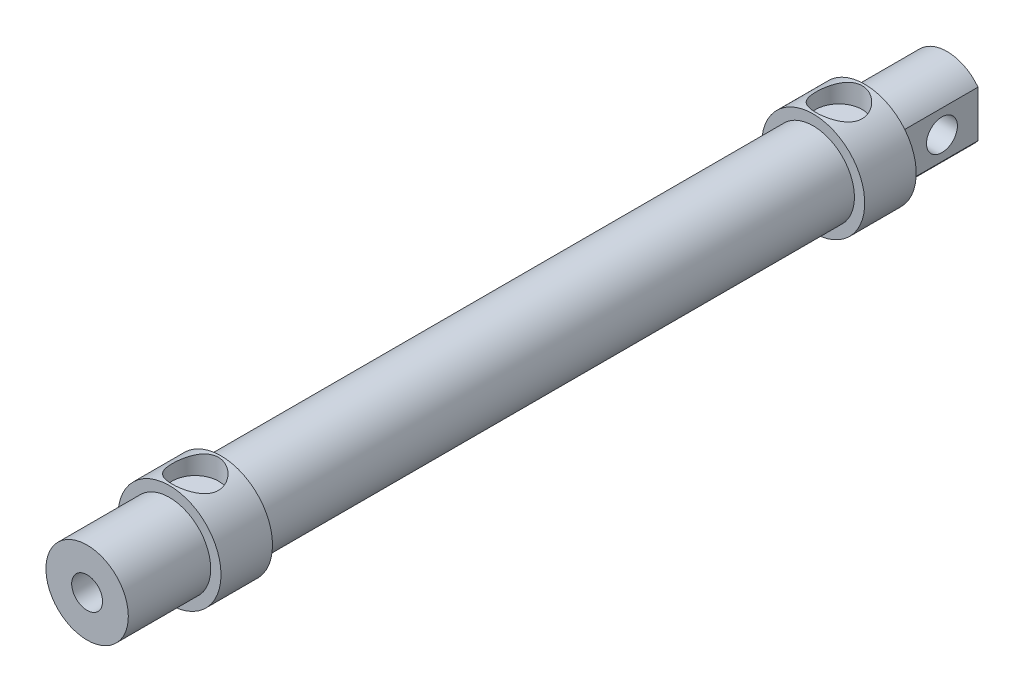
ISO-10303-21;
HEADER;
FILE_DESCRIPTION(('STEP AP214'),'2;1');
FILE_NAME('part.step','',(''),(''),'','','');
FILE_SCHEMA(('AUTOMOTIVE_DESIGN { 1 0 10303 214 1 1 1 1 }'));
ENDSEC;
DATA;
#1=APPLICATION_CONTEXT('core data for automotive mechanical design processes');
#2=APPLICATION_PROTOCOL_DEFINITION('international standard','automotive_design',2000,#1);
#3=PRODUCT_CONTEXT('',#1,'mechanical');
#4=PRODUCT('Part','Part','',(#3));
#5=PRODUCT_RELATED_PRODUCT_CATEGORY('part','',(#4));
#6=PRODUCT_DEFINITION_FORMATION('','',#4);
#7=PRODUCT_DEFINITION_CONTEXT('part definition',#1,'design');
#8=PRODUCT_DEFINITION('design','',#6,#7);
#9=PRODUCT_DEFINITION_SHAPE('','',#8);
#10=(LENGTH_UNIT() NAMED_UNIT(*) SI_UNIT(.MILLI.,.METRE.));
#11=(NAMED_UNIT(*) PLANE_ANGLE_UNIT() SI_UNIT($,.RADIAN.));
#12=(NAMED_UNIT(*) SI_UNIT($,.STERADIAN.) SOLID_ANGLE_UNIT());
#13=UNCERTAINTY_MEASURE_WITH_UNIT(LENGTH_MEASURE(1.E-05),#10,'distance_accuracy_value','');
#14=(GEOMETRIC_REPRESENTATION_CONTEXT(3) GLOBAL_UNCERTAINTY_ASSIGNED_CONTEXT((#13)) GLOBAL_UNIT_ASSIGNED_CONTEXT((#10,
#11,#12)) REPRESENTATION_CONTEXT('',''));
#15=CARTESIAN_POINT('',(0.,0.,0.));
#16=DIRECTION('',(0.,0.,1.));
#17=DIRECTION('',(1.,0.,0.));
#18=AXIS2_PLACEMENT_3D('',#15,#16,#17);
#19=CARTESIAN_POINT('',(0.,0.,-26.));
#20=DIRECTION('',(0.,0.,1.));
#21=DIRECTION('',(1.,0.,0.));
#22=AXIS2_PLACEMENT_3D('',#19,#20,#21);
#23=CYLINDRICAL_SURFACE('',#22,7.5);
#24=CARTESIAN_POINT('',(0.,0.,-26.));
#25=DIRECTION('',(0.,0.,-1.));
#26=DIRECTION('',(-1.,0.,0.));
#27=AXIS2_PLACEMENT_3D('',#24,#25,#26);
#28=CIRCLE('',#27,7.5);
#29=CARTESIAN_POINT('',(6.,-4.5,-26.));
#30=VERTEX_POINT('',#29);
#31=CARTESIAN_POINT('',(-6.,-4.5,-26.));
#32=VERTEX_POINT('',#31);
#33=EDGE_CURVE('E99',#30,#32,#28,.T.);
#34=ORIENTED_EDGE('',*,*,#33,.F.);
#35=DIRECTION('',(0.,0.,-1.));
#36=VECTOR('',#35,1.);
#37=CARTESIAN_POINT('',(6.,-4.5,-0.875856204552675));
#38=LINE('',#37,#36);
#39=CARTESIAN_POINT('',(6.,-4.5,-10.));
#40=VERTEX_POINT('',#39);
#41=EDGE_CURVE('E53',#40,#30,#38,.T.);
#42=ORIENTED_EDGE('',*,*,#41,.F.);
#43=CARTESIAN_POINT('',(0.,0.,-10.));
#44=DIRECTION('',(0.,0.,-1.));
#45=DIRECTION('',(-1.,0.,0.));
#46=AXIS2_PLACEMENT_3D('',#43,#44,#45);
#47=CIRCLE('',#46,7.5);
#48=CARTESIAN_POINT('',(-6.,-4.5,-10.));
#49=VERTEX_POINT('',#48);
#50=EDGE_CURVE('E109',#40,#49,#47,.T.);
#51=ORIENTED_EDGE('',*,*,#50,.T.);
#52=DIRECTION('',(0.,0.,-1.));
#53=VECTOR('',#52,1.);
#54=CARTESIAN_POINT('',(-6.,-4.5,-0.875856204552675));
#55=LINE('',#54,#53);
#56=EDGE_CURVE('E192',#49,#32,#55,.T.);
#57=ORIENTED_EDGE('',*,*,#56,.T.);
#58=EDGE_LOOP('',(#34,#42,#51,#57));
#59=FACE_BOUND('',#58,.T.);
#60=ADVANCED_FACE('F34',(#59),#23,.T.);
#61=CARTESIAN_POINT('',(0.,0.,-10.));
#62=DIRECTION('',(0.,0.,-1.));
#63=DIRECTION('',(-1.,0.,0.));
#64=AXIS2_PLACEMENT_3D('',#61,#62,#63);
#65=PLANE('',#64);
#66=CARTESIAN_POINT('',(0.,0.,-10.));
#67=DIRECTION('',(0.,0.,-1.));
#68=DIRECTION('',(-1.,0.,0.));
#69=AXIS2_PLACEMENT_3D('',#66,#67,#68);
#70=CIRCLE('',#69,10.);
#71=CARTESIAN_POINT('',(-10.,0.,-10.));
#72=VERTEX_POINT('',#71);
#73=EDGE_CURVE('E119',#72,#72,#70,.T.);
#74=ORIENTED_EDGE('',*,*,#73,.T.);
#75=EDGE_LOOP('',(#74));
#76=FACE_BOUND('',#75,.T.);
#77=CARTESIAN_POINT('',(-6.,4.5,-10.));
#78=VERTEX_POINT('',#77);
#79=CARTESIAN_POINT('',(6.,4.5,-10.));
#80=VERTEX_POINT('',#79);
#81=EDGE_CURVE('E93',#78,#80,#47,.T.);
#82=ORIENTED_EDGE('',*,*,#81,.F.);
#83=DIRECTION('',(0.,1.,0.));
#84=VECTOR('',#83,1.);
#85=CARTESIAN_POINT('',(-6.,4.5,-10.));
#86=LINE('',#85,#84);
#87=EDGE_CURVE('E200',#49,#78,#86,.T.);
#88=ORIENTED_EDGE('',*,*,#87,.F.);
#89=ORIENTED_EDGE('',*,*,#50,.F.);
#90=DIRECTION('',(0.,-1.,0.));
#91=VECTOR('',#90,1.);
#92=CARTESIAN_POINT('',(6.,4.5,-10.));
#93=LINE('',#92,#91);
#94=EDGE_CURVE('E94',#80,#40,#93,.T.);
#95=ORIENTED_EDGE('',*,*,#94,.F.);
#96=EDGE_LOOP('',(#82,#88,#89,#95));
#97=FACE_BOUND('',#96,.T.);
#98=ADVANCED_FACE('F168',(#76,#97),#65,.T.);
#99=CARTESIAN_POINT('',(0.,0.,125.));
#100=DIRECTION('',(0.,0.,1.));
#101=DIRECTION('',(1.,0.,0.));
#102=AXIS2_PLACEMENT_3D('',#99,#100,#101);
#103=PLANE('',#102);
#104=CARTESIAN_POINT('',(0.,0.,125.));
#105=DIRECTION('',(0.,0.,1.));
#106=DIRECTION('',(1.,0.,0.));
#107=AXIS2_PLACEMENT_3D('',#104,#105,#106);
#108=CIRCLE('',#107,10.);
#109=CARTESIAN_POINT('',(10.,0.,125.));
#110=VERTEX_POINT('',#109);
#111=EDGE_CURVE('E113',#110,#110,#108,.T.);
#112=ORIENTED_EDGE('',*,*,#111,.T.);
#113=EDGE_LOOP('',(#112));
#114=FACE_BOUND('',#113,.T.);
#115=CARTESIAN_POINT('',(0.,0.,125.));
#116=DIRECTION('',(0.,0.,1.));
#117=DIRECTION('',(1.,0.,0.));
#118=AXIS2_PLACEMENT_3D('',#115,#116,#117);
#119=CIRCLE('',#118,8.);
#120=CARTESIAN_POINT('',(8.,0.,125.));
#121=VERTEX_POINT('',#120);
#122=EDGE_CURVE('E98',#121,#121,#119,.T.);
#123=ORIENTED_EDGE('',*,*,#122,.F.);
#124=EDGE_LOOP('',(#123));
#125=FACE_BOUND('',#124,.T.);
#126=ADVANCED_FACE('F166',(#114,#125),#103,.T.);
#127=CARTESIAN_POINT('',(0.,0.,115.));
#128=DIRECTION('',(0.,0.,-1.));
#129=DIRECTION('',(-1.,0.,0.));
#130=AXIS2_PLACEMENT_3D('',#127,#128,#129);
#131=CYLINDRICAL_SURFACE('',#130,8.);
#132=CARTESIAN_POINT('',(0.,0.,115.));
#133=DIRECTION('',(0.,0.,1.));
#134=DIRECTION('',(1.,0.,0.));
#135=AXIS2_PLACEMENT_3D('',#132,#133,#134);
#136=CIRCLE('',#135,8.);
#137=CARTESIAN_POINT('',(8.,0.,115.));
#138=VERTEX_POINT('',#137);
#139=EDGE_CURVE('E127',#138,#138,#136,.T.);
#140=ORIENTED_EDGE('',*,*,#139,.F.);
#141=EDGE_LOOP('',(#140));
#142=FACE_BOUND('',#141,.T.);
#143=CARTESIAN_POINT('',(0.,0.,0.));
#144=DIRECTION('',(0.,0.,-1.));
#145=DIRECTION('',(-1.,0.,0.));
#146=AXIS2_PLACEMENT_3D('',#143,#144,#145);
#147=CIRCLE('',#146,8.);
#148=CARTESIAN_POINT('',(-8.,0.,0.));
#149=VERTEX_POINT('',#148);
#150=EDGE_CURVE('E122',#149,#149,#147,.T.);
#151=ORIENTED_EDGE('',*,*,#150,.F.);
#152=EDGE_LOOP('',(#151));
#153=FACE_BOUND('',#152,.T.);
#154=ADVANCED_FACE('F36',(#142,#153),#131,.T.);
#155=CARTESIAN_POINT('',(0.,0.,0.));
#156=DIRECTION('',(0.,0.,-1.));
#157=DIRECTION('',(-1.,0.,0.));
#158=AXIS2_PLACEMENT_3D('',#155,#156,#157);
#159=PLANE('',#158);
#160=CARTESIAN_POINT('',(0.,0.,0.));
#161=DIRECTION('',(0.,0.,-1.));
#162=DIRECTION('',(-1.,0.,0.));
#163=AXIS2_PLACEMENT_3D('',#160,#161,#162);
#164=CIRCLE('',#163,10.);
#165=CARTESIAN_POINT('',(-10.,0.,0.));
#166=VERTEX_POINT('',#165);
#167=EDGE_CURVE('E116',#166,#166,#164,.T.);
#168=ORIENTED_EDGE('',*,*,#167,.F.);
#169=EDGE_LOOP('',(#168));
#170=FACE_BOUND('',#169,.T.);
#171=ORIENTED_EDGE('',*,*,#150,.T.);
#172=EDGE_LOOP('',(#171));
#173=FACE_BOUND('',#172,.T.);
#174=ADVANCED_FACE('F179',(#170,#173),#159,.F.);
#175=CARTESIAN_POINT('',(0.,0.,-10.));
#176=DIRECTION('',(0.,0.,1.));
#177=DIRECTION('',(1.,0.,0.));
#178=AXIS2_PLACEMENT_3D('',#175,#176,#177);
#179=CYLINDRICAL_SURFACE('',#178,10.);
#180=CARTESIAN_POINT('',(0.,10.,-0.5));
#181=CARTESIAN_POINT('',(-0.119714899377499,9.9999992514518,-0.500000890002053));
#182=CARTESIAN_POINT('',(-0.239458239717201,9.99784463505232,-0.504783412476652));
#183=CARTESIAN_POINT('',(-0.478080983317484,9.98927965727141,-0.523865659464688));
#184=CARTESIAN_POINT('',(-0.596959866644426,9.98286691941227,-0.5381706985508));
#185=CARTESIAN_POINT('',(-0.833135767847142,9.96593822146435,-0.576176454268108));
#186=CARTESIAN_POINT('',(-0.95042948162941,9.95541475137588,-0.599894368791951));
#187=CARTESIAN_POINT('',(-1.18241652499653,9.93053425585604,-0.656481215828374));
#188=CARTESIAN_POINT('',(-1.29710877072352,9.9161756632967,-0.689353889441735));
#189=CARTESIAN_POINT('',(-1.52263079506398,9.88405335147029,-0.76377129881031));
#190=CARTESIAN_POINT('',(-1.63347432992206,9.86630365187219,-0.805280390300351));
#191=CARTESIAN_POINT('',(-1.85112746101417,9.82779572783996,-0.896674636814239));
#192=CARTESIAN_POINT('',(-1.95793552697273,9.80703637627835,-0.94656293099961));
#193=CARTESIAN_POINT('',(-2.27123792734134,9.74098955379221,-1.10813742169027));
#194=CARTESIAN_POINT('',(-2.47089116747384,9.6918914827054,-1.23182671204988));
#195=CARTESIAN_POINT('',(-2.85732103985941,9.58530406137092,-1.51487693309343));
#196=CARTESIAN_POINT('',(-3.0428957633747,9.52751186527258,-1.67575321002514));
#197=CARTESIAN_POINT('',(-3.38550875317661,9.4112213394932,-2.02538852490223));
#198=CARTESIAN_POINT('',(-3.5425295803198,9.35272260139618,-2.21416447571153));
#199=CARTESIAN_POINT('',(-3.83290348383043,9.23768019338741,-2.6280080759245));
#200=CARTESIAN_POINT('',(-3.96429017948437,9.18146042532477,-2.85456750336845));
#201=CARTESIAN_POINT('',(-4.13093390700541,9.10708951066568,-3.2104155566));
#202=CARTESIAN_POINT('',(-4.18142203880366,9.08395233098873,-3.33174721937629));
#203=CARTESIAN_POINT('',(-4.27176580262694,9.04181979927299,-3.57897853706182));
#204=CARTESIAN_POINT('',(-4.31162720701697,9.02282219967141,-3.70487566964333));
#205=CARTESIAN_POINT('',(-4.37841999028415,8.99059179237455,-3.95351636569529));
#206=CARTESIAN_POINT('',(-4.40592440136942,8.97710693927065,-4.07607376082319));
#207=CARTESIAN_POINT('',(-4.45062326107638,8.95503078908064,-4.32343771638688));
#208=CARTESIAN_POINT('',(-4.46782272017156,8.94643711390801,-4.44824315332329));
#209=CARTESIAN_POINT('',(-4.49169233969261,8.93447700956661,-4.69906118347091));
#210=CARTESIAN_POINT('',(-4.49836639340772,8.93110864759093,-4.82507331297275));
#211=CARTESIAN_POINT('',(-4.50110340099379,8.92972961454464,-5.07723625895438));
#212=CARTESIAN_POINT('',(-4.49716706417789,8.93171858533204,-5.20338706559995));
#213=CARTESIAN_POINT('',(-4.47959284063994,8.94054436393744,-5.4430787367774));
#214=CARTESIAN_POINT('',(-4.46688667651571,8.94691540416729,-5.55670597513979));
#215=CARTESIAN_POINT('',(-4.43293658086699,8.96378380003499,-5.78237804022222));
#216=CARTESIAN_POINT('',(-4.41168989784837,8.97428248545005,-5.8944223449158));
#217=CARTESIAN_POINT('',(-4.33544598173778,9.011503722142,-6.22699755312078));
#218=CARTESIAN_POINT('',(-4.26793076595448,9.04395916378106,-6.44415783870878));
#219=CARTESIAN_POINT('',(-4.10015888915263,9.12125693016516,-6.86871203227035));
#220=CARTESIAN_POINT('',(-3.99919587349869,9.16636294593646,-7.07577372133454));
#221=CARTESIAN_POINT('',(-3.76787528527297,9.26384610310325,-7.47093999468946));
#222=CARTESIAN_POINT('',(-3.63750520457291,9.31622633489086,-7.65903646282433));
#223=CARTESIAN_POINT('',(-3.33583227515682,9.4287142395038,-8.03069920903984));
#224=CARTESIAN_POINT('',(-3.16173786385567,9.48907048526043,-8.21192585812123));
#225=CARTESIAN_POINT('',(-2.78500415457925,9.60638078718318,-8.54353558496202));
#226=CARTESIAN_POINT('',(-2.58235582919845,9.66333375925335,-8.69390887126685));
#227=CARTESIAN_POINT('',(-2.25721570243328,9.74258846497997,-8.89512020664333));
#228=CARTESIAN_POINT('',(-2.1433872205526,9.76832203062482,-8.95891242814095));
#229=CARTESIAN_POINT('',(-1.91009036946106,9.81660379138816,-9.07659125533208));
#230=CARTESIAN_POINT('',(-1.79062435375876,9.83915330033476,-9.13048194944534));
#231=CARTESIAN_POINT('',(-1.54690648548244,9.88040267650027,-9.22780064333651));
#232=CARTESIAN_POINT('',(-1.42265607187478,9.89910369063005,-9.27123176088862));
#233=CARTESIAN_POINT('',(-1.17028710145184,9.93210014831025,-9.34715821062613));
#234=CARTESIAN_POINT('',(-1.04216889591685,9.94639599063306,-9.37965453269401));
#235=CARTESIAN_POINT('',(-0.792376984920266,9.96928945175045,-9.43139136776798));
#236=CARTESIAN_POINT('',(-0.670894892411247,9.97822061403935,-9.45141166745289));
#237=CARTESIAN_POINT('',(-0.426459268412432,9.9916520406954,-9.48143859694167));
#238=CARTESIAN_POINT('',(-0.303505835771769,9.99615260105112,-9.4914458956698));
#239=CARTESIAN_POINT('',(-0.0571459633958022,10.0005953916074,-9.50132510559218));
#240=CARTESIAN_POINT('',(0.0662603342467419,10.0005389466492,-9.50119996255352));
#241=CARTESIAN_POINT('',(0.312555788056655,9.99587319016683,-9.49082418918375));
#242=CARTESIAN_POINT('',(0.435444959409023,9.99126401328015,-9.48057385828387));
#243=CARTESIAN_POINT('',(0.67237330219901,9.97803225420679,-9.45098782056628));
#244=CARTESIAN_POINT('',(0.786500047827908,9.9696678602719,-9.4322359240705));
#245=CARTESIAN_POINT('',(1.01266797335818,9.94924261322972,-9.38609693677835));
#246=CARTESIAN_POINT('',(1.12470846873294,9.93718056877868,-9.35870706283538));
#247=CARTESIAN_POINT('',(1.45652628438278,9.89585863600817,-9.26395657040564));
#248=CARTESIAN_POINT('',(1.67220954839673,9.86145048700206,-9.18398844309207));
#249=CARTESIAN_POINT('',(2.09364161657217,9.78081050149538,-8.99026516024635));
#250=CARTESIAN_POINT('',(2.29887244489482,9.7342440610747,-8.87553607676711));
#251=CARTESIAN_POINT('',(2.68794274227257,9.63407218762379,-8.61657138991768));
#252=CARTESIAN_POINT('',(2.87177279900524,9.58046367930153,-8.47232287988325));
#253=CARTESIAN_POINT('',(3.22874481881242,9.46642342235631,-8.14462956850864));
#254=CARTESIAN_POINT('',(3.39975739919774,9.40579345325527,-7.95893420918039));
#255=CARTESIAN_POINT('',(3.7089928529427,9.28820745525924,-7.56063731302618));
#256=CARTESIAN_POINT('',(3.84720314960723,9.23125284160317,-7.3480255039413));
#257=CARTESIAN_POINT('',(4.02836218298274,9.15296575683414,-7.00979638048813));
#258=CARTESIAN_POINT('',(4.08494101420093,9.12778463759271,-6.89218603099664));
#259=CARTESIAN_POINT('',(4.18787248114614,9.08101974034093,-6.65190156568623));
#260=CARTESIAN_POINT('',(4.2342296566971,9.05943436636988,-6.52922972672152));
#261=CARTESIAN_POINT('',(4.31618722109356,9.02067545662568,-6.27975073171213));
#262=CARTESIAN_POINT('',(4.35179413888921,9.00349924399134,-6.15294613767421));
#263=CARTESIAN_POINT('',(4.41183693193977,8.97423060317641,-5.89614401561104));
#264=CARTESIAN_POINT('',(4.43627411415682,8.96213758022901,-5.76614686302123));
#265=CARTESIAN_POINT('',(4.47202091449907,8.94434960712291,-5.51541826278566));
#266=CARTESIAN_POINT('',(4.4842807024604,8.93819292562724,-5.39485427283057));
#267=CARTESIAN_POINT('',(4.49903019914858,8.93077809281634,-5.15298260566588));
#268=CARTESIAN_POINT('',(4.5015205682304,8.92951961041187,-5.0316749792769));
#269=CARTESIAN_POINT('',(4.49669929744397,8.93194839334479,-4.7893299111345));
#270=CARTESIAN_POINT('',(4.48938957603767,8.93563469069406,-4.66829242114495));
#271=CARTESIAN_POINT('',(4.46506798264277,8.94781267924994,-4.42744554285085));
#272=CARTESIAN_POINT('',(4.44805628051732,8.95630428632473,-4.30763613308236));
#273=CARTESIAN_POINT('',(4.40592367546869,8.97710145887841,-4.07771284236705));
#274=CARTESIAN_POINT('',(4.38138644823706,8.98913052816038,-3.96746647533706));
#275=CARTESIAN_POINT('',(4.3242379973795,9.016760258177,-3.74953045357018));
#276=CARTESIAN_POINT('',(4.29162401522606,9.03236213902907,-3.64184168615339));
#277=CARTESIAN_POINT('',(4.18209790413275,9.08386579740127,-3.3236018253385));
#278=CARTESIAN_POINT('',(4.09347240108939,9.12448081079357,-3.11772001581903));
#279=CARTESIAN_POINT('',(3.88104703097752,9.21692269648097,-2.71007954773134));
#280=CARTESIAN_POINT('',(3.75534202990489,9.26930504512267,-2.50944994717334));
#281=CARTESIAN_POINT('',(3.47477312444683,9.37809249113928,-2.13093860235509));
#282=CARTESIAN_POINT('',(3.31989665958057,9.43449931482618,-1.95306671258599));
#283=CARTESIAN_POINT('',(2.96865270415693,9.55113675133759,-1.60841002335675));
#284=CARTESIAN_POINT('',(2.7697974169835,9.61125079600769,-1.44408972325795));
#285=CARTESIAN_POINT('',(2.451697736392,9.69542725222155,-1.22430517835498));
#286=CARTESIAN_POINT('',(2.34226381477152,9.7225067115913,-1.15544749171922));
#287=CARTESIAN_POINT('',(2.11740450774386,9.77393805362308,-1.02717708698299));
#288=CARTESIAN_POINT('',(2.00198193536715,9.79829120023319,-0.967759986722742));
#289=CARTESIAN_POINT('',(1.76699253742287,9.84336943677559,-0.85942943181218));
#290=CARTESIAN_POINT('',(1.64747506142007,9.8641265763463,-0.81042220355186));
#291=CARTESIAN_POINT('',(1.40416398949856,9.90168985287585,-0.722730737933654));
#292=CARTESIAN_POINT('',(1.28037249014286,9.91849789629377,-0.684041518247569));
#293=CARTESIAN_POINT('',(1.02972097012304,9.94764083982698,-0.617483426496842));
#294=CARTESIAN_POINT('',(0.90286899929365,9.95998634549706,-0.589588888767578));
#295=CARTESIAN_POINT('',(0.64692353237821,9.97987682190862,-0.544851730685118));
#296=CARTESIAN_POINT('',(0.517831638287638,9.98742508914182,-0.528001520812594));
#297=CARTESIAN_POINT('',(0.32368296793252,9.99496914098584,-0.511188557769922));
#298=CARTESIAN_POINT('',(0.259036146622593,9.99685406786943,-0.506994634848498));
#299=CARTESIAN_POINT('',(0.129595662689027,9.99936970855439,-0.501400095969313));
#300=CARTESIAN_POINT('',(0.0648019980679326,10.0000004051912,-0.499999518239486));
#301=CARTESIAN_POINT('',(0.,10.,-0.5));
#302=B_SPLINE_CURVE_WITH_KNOTS('',3,(#180,#181,#182,#183,#184,#185,#186,#187,#188,#189,#190,
#191,#192,#193,#194,#195,#196,#197,#198,#199,#200,#201,#202,#203,#204,#205,#206,#207,#208,#209,
#210,#211,#212,#213,#214,#215,#216,#217,#218,#219,#220,#221,#222,#223,#224,#225,#226,#227,#228,
#229,#230,#231,#232,#233,#234,#235,#236,#237,#238,#239,#240,#241,#242,#243,#244,#245,#246,#247,
#248,#249,#250,#251,#252,#253,#254,#255,#256,#257,#258,#259,#260,#261,#262,#263,#264,#265,#266,
#267,#268,#269,#270,#271,#272,#273,#274,#275,#276,#277,#278,#279,#280,#281,#282,#283,#284,#285,
#286,#287,#288,#289,#290,#291,#292,#293,#294,#295,#296,#297,#298,#299,#300,#301),.UNSPECIFIED.,
.T.,.F.,(4,2,2,2,2,2,2,2,2,2,2,2,2,2,2,2,2,2,2,2,2,2,2,2,2,2,2,2,2,2,2,2,2,2,2,2,2,2,2,2,2,2,2,
2,2,2,2,2,2,2,2,2,2,2,2,2,2,2,2,2,4),(0.,0.359079766319795,0.718360105383011,1.07829991585421,
1.43838703244486,1.79701647223383,2.15578056888792,2.87242277909538,3.62616960499523,
4.38037524297132,5.17949629217535,5.57935055595989,5.9789871770606,6.35745629849475,
6.73574125103079,7.11388624520866,7.49200596071636,7.83512607615004,8.1783568231084,
8.86426196528475,9.56568894241472,10.2674148320078,11.0394072404648,11.8116442665593,
12.2102018577121,12.6085945095896,13.0068682618196,13.4051059502435,13.7749562785481,
14.1447818971397,14.514499998092,14.8842071657334,15.2316678829995,15.579240666289,
16.2737589298737,16.9898887001225,17.7063322525595,18.4818198750701,19.2576043480189,
19.6559156754215,20.0540497397624,20.4519415168204,20.8497867249427,21.2133308553316,
21.5768504118624,21.9402988163336,22.3037408577126,22.6440991624995,22.9845738736592,
23.6650470945947,24.3895568934342,25.1143793636261,25.9048702890336,26.3007656588533,
26.6964767204835,27.0884558939879,27.4802454456701,27.8710976613984,28.2616810061527,
28.4560491926108,28.6504200390491),.UNSPECIFIED.);
#303=CARTESIAN_POINT('',(0.,10.,-0.5));
#304=VERTEX_POINT('',#303);
#305=EDGE_CURVE('E11',#304,#304,#302,.T.);
#306=ORIENTED_EDGE('',*,*,#305,.T.);
#307=EDGE_LOOP('',(#306));
#308=FACE_BOUND('',#307,.T.);
#309=ORIENTED_EDGE('',*,*,#73,.F.);
#310=EDGE_LOOP('',(#309));
#311=FACE_BOUND('',#310,.T.);
#312=ORIENTED_EDGE('',*,*,#167,.T.);
#313=EDGE_LOOP('',(#312));
#314=FACE_BOUND('',#313,.T.);
#315=ADVANCED_FACE('F172',(#308,#311,#314),#179,.T.);
#316=CARTESIAN_POINT('',(0.,0.,115.));
#317=DIRECTION('',(0.,0.,1.));
#318=DIRECTION('',(1.,0.,0.));
#319=AXIS2_PLACEMENT_3D('',#316,#317,#318);
#320=PLANE('',#319);
#321=CARTESIAN_POINT('',(0.,0.,115.));
#322=DIRECTION('',(0.,0.,1.));
#323=DIRECTION('',(1.,0.,0.));
#324=AXIS2_PLACEMENT_3D('',#321,#322,#323);
#325=CIRCLE('',#324,10.);
#326=CARTESIAN_POINT('',(10.,0.,115.));
#327=VERTEX_POINT('',#326);
#328=EDGE_CURVE('E111',#327,#327,#325,.T.);
#329=ORIENTED_EDGE('',*,*,#328,.F.);
#330=EDGE_LOOP('',(#329));
#331=FACE_BOUND('',#330,.T.);
#332=ORIENTED_EDGE('',*,*,#139,.T.);
#333=EDGE_LOOP('',(#332));
#334=FACE_BOUND('',#333,.T.);
#335=ADVANCED_FACE('F170',(#331,#334),#320,.F.);
#336=CARTESIAN_POINT('',(0.,0.,125.));
#337=DIRECTION('',(0.,0.,-1.));
#338=DIRECTION('',(-1.,0.,0.));
#339=AXIS2_PLACEMENT_3D('',#336,#337,#338);
#340=CYLINDRICAL_SURFACE('',#339,10.);
#341=CARTESIAN_POINT('',(0.,10.,124.5));
#342=CARTESIAN_POINT('',(-0.119714899377498,9.9999992514518,124.499999109998));
#343=CARTESIAN_POINT('',(-0.2394582397172,9.99784463505232,124.495216587523));
#344=CARTESIAN_POINT('',(-0.478080983317483,9.98927965727141,124.476134340535));
#345=CARTESIAN_POINT('',(-0.596959866644424,9.98286691941227,124.461829301449));
#346=CARTESIAN_POINT('',(-0.83313576784714,9.96593822146435,124.423823545732));
#347=CARTESIAN_POINT('',(-0.950429481629406,9.95541475137588,124.400105631208));
#348=CARTESIAN_POINT('',(-1.18241652499653,9.93053425585604,124.343518784172));
#349=CARTESIAN_POINT('',(-1.29710877072352,9.9161756632967,124.310646110558));
#350=CARTESIAN_POINT('',(-1.52263079506397,9.88405335147029,124.23622870119));
#351=CARTESIAN_POINT('',(-1.63347432992206,9.86630365187219,124.1947196097));
#352=CARTESIAN_POINT('',(-1.85112746101416,9.82779572783996,124.103325363186));
#353=CARTESIAN_POINT('',(-1.95793552697272,9.80703637627835,124.053437069));
#354=CARTESIAN_POINT('',(-2.27123792734133,9.74098955379221,123.89186257831));
#355=CARTESIAN_POINT('',(-2.47089116747383,9.6918914827054,123.76817328795));
#356=CARTESIAN_POINT('',(-2.85732103985941,9.58530406137092,123.485123066907));
#357=CARTESIAN_POINT('',(-3.04289576337469,9.52751186527258,123.324246789975));
#358=CARTESIAN_POINT('',(-3.38550875317661,9.4112213394932,122.974611475098));
#359=CARTESIAN_POINT('',(-3.54252958031979,9.35272260139618,122.785835524288));
#360=CARTESIAN_POINT('',(-3.83290348383043,9.23768019338741,122.371991924076));
#361=CARTESIAN_POINT('',(-3.96429017948437,9.18146042532477,122.145432496632));
#362=CARTESIAN_POINT('',(-4.13093390700541,9.10708951066568,121.7895844434));
#363=CARTESIAN_POINT('',(-4.18142203880367,9.08395233098873,121.668252780624));
#364=CARTESIAN_POINT('',(-4.27176580262694,9.04181979927299,121.421021462938));
#365=CARTESIAN_POINT('',(-4.31162720701697,9.02282219967141,121.295124330357));
#366=CARTESIAN_POINT('',(-4.37841999028415,8.99059179237455,121.046483634305));
#367=CARTESIAN_POINT('',(-4.40592440136942,8.97710693927066,120.923926239177));
#368=CARTESIAN_POINT('',(-4.45062326107638,8.95503078908064,120.676562283613));
#369=CARTESIAN_POINT('',(-4.46782272017156,8.94643711390801,120.551756846677));
#370=CARTESIAN_POINT('',(-4.49169233969261,8.93447700956661,120.300938816529));
#371=CARTESIAN_POINT('',(-4.49836639340772,8.93110864759093,120.174926687027));
#372=CARTESIAN_POINT('',(-4.50110340099379,8.92972961454464,119.922763741046));
#373=CARTESIAN_POINT('',(-4.49716706417789,8.93171858533204,119.7966129344));
#374=CARTESIAN_POINT('',(-4.47959284063994,8.94054436393744,119.556921263223));
#375=CARTESIAN_POINT('',(-4.46688667651572,8.94691540416729,119.44329402486));
#376=CARTESIAN_POINT('',(-4.432936580867,8.96378380003499,119.217621959778));
#377=CARTESIAN_POINT('',(-4.41168989784837,8.97428248545005,119.105577655084));
#378=CARTESIAN_POINT('',(-4.33544598173778,9.01150372214199,118.773002446879));
#379=CARTESIAN_POINT('',(-4.26793076595448,9.04395916378106,118.555842161291));
#380=CARTESIAN_POINT('',(-4.10015888915263,9.12125693016516,118.13128796773));
#381=CARTESIAN_POINT('',(-3.99919587349869,9.16636294593646,117.924226278665));
#382=CARTESIAN_POINT('',(-3.76787528527297,9.26384610310325,117.529060005311));
#383=CARTESIAN_POINT('',(-3.63750520457291,9.31622633489086,117.340963537176));
#384=CARTESIAN_POINT('',(-3.33583227515681,9.4287142395038,116.96930079096));
#385=CARTESIAN_POINT('',(-3.16173786385566,9.48907048526043,116.788074141879));
#386=CARTESIAN_POINT('',(-2.78500415457925,9.60638078718318,116.456464415038));
#387=CARTESIAN_POINT('',(-2.58235582919844,9.66333375925335,116.306091128733));
#388=CARTESIAN_POINT('',(-2.25721570243328,9.74258846497997,116.104879793357));
#389=CARTESIAN_POINT('',(-2.1433872205526,9.76832203062482,116.041087571859));
#390=CARTESIAN_POINT('',(-1.91009036946106,9.81660379138816,115.923408744668));
#391=CARTESIAN_POINT('',(-1.79062435375876,9.83915330033476,115.869518050555));
#392=CARTESIAN_POINT('',(-1.54690648548244,9.88040267650027,115.772199356663));
#393=CARTESIAN_POINT('',(-1.42265607187478,9.89910369063005,115.728768239111));
#394=CARTESIAN_POINT('',(-1.17028710145184,9.93210014831025,115.652841789374));
#395=CARTESIAN_POINT('',(-1.04216889591685,9.94639599063306,115.620345467306));
#396=CARTESIAN_POINT('',(-0.79237698492026,9.96928945175045,115.568608632232));
#397=CARTESIAN_POINT('',(-0.670894892411243,9.97822061403935,115.548588332547));
#398=CARTESIAN_POINT('',(-0.426459268412429,9.9916520406954,115.518561403058));
#399=CARTESIAN_POINT('',(-0.303505835771766,9.99615260105112,115.50855410433));
#400=CARTESIAN_POINT('',(-0.0571459633957996,10.0005953916074,115.498674894408));
#401=CARTESIAN_POINT('',(0.0662603342467432,10.0005389466492,115.498800037446));
#402=CARTESIAN_POINT('',(0.312555788056655,9.99587319016683,115.509175810816));
#403=CARTESIAN_POINT('',(0.435444959409022,9.99126401328015,115.519426141716));
#404=CARTESIAN_POINT('',(0.672373302199009,9.97803225420679,115.549012179434));
#405=CARTESIAN_POINT('',(0.786500047827907,9.9696678602719,115.567764075929));
#406=CARTESIAN_POINT('',(1.01266797335818,9.94924261322972,115.613903063222));
#407=CARTESIAN_POINT('',(1.12470846873294,9.93718056877868,115.641292937165));
#408=CARTESIAN_POINT('',(1.45652628438278,9.89585863600817,115.736043429594));
#409=CARTESIAN_POINT('',(1.67220954839673,9.86145048700206,115.816011556908));
#410=CARTESIAN_POINT('',(2.09364161657217,9.78081050149538,116.009734839754));
#411=CARTESIAN_POINT('',(2.29887244489482,9.7342440610747,116.124463923233));
#412=CARTESIAN_POINT('',(2.68794274227257,9.63407218762379,116.383428610082));
#413=CARTESIAN_POINT('',(2.87177279900525,9.58046367930153,116.527677120117));
#414=CARTESIAN_POINT('',(3.22874481881242,9.46642342235631,116.855370431491));
#415=CARTESIAN_POINT('',(3.39975739919774,9.40579345325527,117.04106579082));
#416=CARTESIAN_POINT('',(3.7089928529427,9.28820745525924,117.439362686974));
#417=CARTESIAN_POINT('',(3.84720314960724,9.23125284160317,117.651974496059));
#418=CARTESIAN_POINT('',(4.02836218298274,9.15296575683413,117.990203619512));
#419=CARTESIAN_POINT('',(4.08494101420092,9.12778463759271,118.107813969003));
#420=CARTESIAN_POINT('',(4.18787248114613,9.08101974034093,118.348098434314));
#421=CARTESIAN_POINT('',(4.2342296566971,9.05943436636988,118.470770273278));
#422=CARTESIAN_POINT('',(4.31618722109356,9.02067545662567,118.720249268288));
#423=CARTESIAN_POINT('',(4.35179413888921,9.00349924399134,118.847053862326));
#424=CARTESIAN_POINT('',(4.41183693193977,8.9742306031764,119.103855984389));
#425=CARTESIAN_POINT('',(4.43627411415682,8.96213758022901,119.233853136979));
#426=CARTESIAN_POINT('',(4.47202091449907,8.94434960712291,119.484581737214));
#427=CARTESIAN_POINT('',(4.4842807024604,8.93819292562723,119.605145727169));
#428=CARTESIAN_POINT('',(4.49903019914858,8.93077809281634,119.847017394334));
#429=CARTESIAN_POINT('',(4.50152056823041,8.92951961041187,119.968325020723));
#430=CARTESIAN_POINT('',(4.49669929744397,8.93194839334479,120.210670088865));
#431=CARTESIAN_POINT('',(4.48938957603767,8.93563469069406,120.331707578855));
#432=CARTESIAN_POINT('',(4.46506798264277,8.94781267924994,120.572554457149));
#433=CARTESIAN_POINT('',(4.44805628051733,8.95630428632473,120.692363866918));
#434=CARTESIAN_POINT('',(4.4059236754687,8.97710145887841,120.922287157633));
#435=CARTESIAN_POINT('',(4.38138644823706,8.98913052816038,121.032533524663));
#436=CARTESIAN_POINT('',(4.32423799737951,9.01676025817699,121.25046954643));
#437=CARTESIAN_POINT('',(4.29162401522606,9.03236213902907,121.358158313847));
#438=CARTESIAN_POINT('',(4.18209790413276,9.08386579740127,121.676398174662));
#439=CARTESIAN_POINT('',(4.09347240108939,9.12448081079357,121.882279984181));
#440=CARTESIAN_POINT('',(3.88104703097752,9.21692269648097,122.289920452269));
#441=CARTESIAN_POINT('',(3.75534202990489,9.26930504512267,122.490550052827));
#442=CARTESIAN_POINT('',(3.47477312444683,9.37809249113928,122.869061397645));
#443=CARTESIAN_POINT('',(3.31989665958057,9.43449931482618,123.046933287414));
#444=CARTESIAN_POINT('',(2.96865270415693,9.55113675133759,123.391589976643));
#445=CARTESIAN_POINT('',(2.7697974169835,9.61125079600769,123.555910276742));
#446=CARTESIAN_POINT('',(2.45169773639201,9.69542725222155,123.775694821645));
#447=CARTESIAN_POINT('',(2.34226381477153,9.7225067115913,123.844552508281));
#448=CARTESIAN_POINT('',(2.11740450774387,9.77393805362308,123.972822913017));
#449=CARTESIAN_POINT('',(2.00198193536716,9.79829120023319,124.032240013277));
#450=CARTESIAN_POINT('',(1.76699253742287,9.84336943677559,124.140570568188));
#451=CARTESIAN_POINT('',(1.64747506142008,9.8641265763463,124.189577796448));
#452=CARTESIAN_POINT('',(1.40416398949857,9.90168985287585,124.277269262066));
#453=CARTESIAN_POINT('',(1.28037249014287,9.91849789629376,124.315958481752));
#454=CARTESIAN_POINT('',(1.02972097012305,9.94764083982698,124.382516573503));
#455=CARTESIAN_POINT('',(0.902868999293656,9.95998634549706,124.410411111232));
#456=CARTESIAN_POINT('',(0.646923532378215,9.97987682190862,124.455148269315));
#457=CARTESIAN_POINT('',(0.517831638287643,9.98742508914182,124.471998479187));
#458=CARTESIAN_POINT('',(0.323682967932525,9.99496914098584,124.48881144223));
#459=CARTESIAN_POINT('',(0.259036146622597,9.99685406786943,124.493005365152));
#460=CARTESIAN_POINT('',(0.129595662689029,9.99936970855439,124.498599904031));
#461=CARTESIAN_POINT('',(0.0648019980679337,10.0000004051912,124.500000481761));
#462=CARTESIAN_POINT('',(0.,10.,124.5));
#463=B_SPLINE_CURVE_WITH_KNOTS('',3,(#341,#342,#343,#344,#345,#346,#347,#348,#349,#350,#351,
#352,#353,#354,#355,#356,#357,#358,#359,#360,#361,#362,#363,#364,#365,#366,#367,#368,#369,#370,
#371,#372,#373,#374,#375,#376,#377,#378,#379,#380,#381,#382,#383,#384,#385,#386,#387,#388,#389,
#390,#391,#392,#393,#394,#395,#396,#397,#398,#399,#400,#401,#402,#403,#404,#405,#406,#407,#408,
#409,#410,#411,#412,#413,#414,#415,#416,#417,#418,#419,#420,#421,#422,#423,#424,#425,#426,#427,
#428,#429,#430,#431,#432,#433,#434,#435,#436,#437,#438,#439,#440,#441,#442,#443,#444,#445,#446,
#447,#448,#449,#450,#451,#452,#453,#454,#455,#456,#457,#458,#459,#460,#461,#462),.UNSPECIFIED.,
.T.,.F.,(4,2,2,2,2,2,2,2,2,2,2,2,2,2,2,2,2,2,2,2,2,2,2,2,2,2,2,2,2,2,2,2,2,2,2,2,2,2,2,2,2,2,2,
2,2,2,2,2,2,2,2,2,2,2,2,2,2,2,2,2,4),(0.,0.359079766319794,0.71836010538301,1.07829991585421,
1.43838703244486,1.79701647223382,2.15578056888791,2.87242277909538,3.62616960499522,
4.38037524297132,5.17949629217536,5.57935055595991,5.97898717706061,6.35745629849476,
6.73574125103079,7.11388624520865,7.49200596071635,7.83512607615,8.1783568231084,
8.86426196528474,9.5656889424147,10.2674148320079,11.0394072404648,11.8116442665593,
12.2102018577121,12.6085945095896,13.0068682618196,13.4051059502435,13.7749562785481,
14.1447818971397,14.514499998092,14.8842071657334,15.2316678829995,15.579240666289,
16.2737589298737,16.9898887001225,17.7063322525595,18.4818198750701,19.2576043480189,
19.6559156754215,20.0540497397623,20.4519415168204,20.8497867249427,21.2133308553316,
21.5768504118624,21.9402988163336,22.3037408577126,22.6440991624995,22.9845738736592,
23.6650470945947,24.3895568934343,25.1143793636261,25.9048702890336,26.3007656588533,
26.6964767204835,27.0884558939879,27.4802454456702,27.8710976613984,28.2616810061527,
28.4560491926108,28.6504200390492),.UNSPECIFIED.);
#464=CARTESIAN_POINT('',(0.,10.,124.5));
#465=VERTEX_POINT('',#464);
#466=EDGE_CURVE('E46',#465,#465,#463,.T.);
#467=ORIENTED_EDGE('',*,*,#466,.T.);
#468=EDGE_LOOP('',(#467));
#469=FACE_BOUND('',#468,.T.);
#470=ORIENTED_EDGE('',*,*,#111,.F.);
#471=EDGE_LOOP('',(#470));
#472=FACE_BOUND('',#471,.T.);
#473=ORIENTED_EDGE('',*,*,#328,.T.);
#474=EDGE_LOOP('',(#473));
#475=FACE_BOUND('',#474,.T.);
#476=ADVANCED_FACE('F135',(#469,#472,#475),#340,.T.);
#477=CARTESIAN_POINT('',(0.,0.,141.));
#478=DIRECTION('',(0.,0.,-1.));
#479=DIRECTION('',(-1.,0.,0.));
#480=AXIS2_PLACEMENT_3D('',#477,#478,#479);
#481=CYLINDRICAL_SURFACE('',#480,8.);
#482=CARTESIAN_POINT('',(0.,0.,141.));
#483=DIRECTION('',(0.,0.,1.));
#484=DIRECTION('',(1.,0.,0.));
#485=AXIS2_PLACEMENT_3D('',#482,#483,#484);
#486=CIRCLE('',#485,8.);
#487=CARTESIAN_POINT('',(8.,0.,141.));
#488=VERTEX_POINT('',#487);
#489=EDGE_CURVE('E102',#488,#488,#486,.T.);
#490=ORIENTED_EDGE('',*,*,#489,.F.);
#491=EDGE_LOOP('',(#490));
#492=FACE_BOUND('',#491,.T.);
#493=ORIENTED_EDGE('',*,*,#122,.T.);
#494=EDGE_LOOP('',(#493));
#495=FACE_BOUND('',#494,.T.);
#496=ADVANCED_FACE('F161',(#492,#495),#481,.T.);
#497=CARTESIAN_POINT('',(0.,0.,141.));
#498=DIRECTION('',(0.,0.,1.));
#499=DIRECTION('',(1.,0.,0.));
#500=AXIS2_PLACEMENT_3D('',#497,#498,#499);
#501=PLANE('',#500);
#502=CARTESIAN_POINT('',(0.,0.,141.));
#503=DIRECTION('',(0.,0.,1.));
#504=DIRECTION('',(1.,0.,0.));
#505=AXIS2_PLACEMENT_3D('',#502,#503,#504);
#506=CIRCLE('',#505,3.);
#507=CARTESIAN_POINT('',(3.,0.,141.));
#508=VERTEX_POINT('',#507);
#509=EDGE_CURVE('E106',#508,#508,#506,.T.);
#510=ORIENTED_EDGE('',*,*,#509,.F.);
#511=EDGE_LOOP('',(#510));
#512=FACE_BOUND('',#511,.T.);
#513=ORIENTED_EDGE('',*,*,#489,.T.);
#514=EDGE_LOOP('',(#513));
#515=FACE_BOUND('',#514,.T.);
#516=ADVANCED_FACE('F158',(#512,#515),#501,.T.);
#517=ORIENTED_EDGE('',*,*,#81,.T.);
#518=DIRECTION('',(0.,0.,-1.));
#519=VECTOR('',#518,1.);
#520=CARTESIAN_POINT('',(6.,4.5,-0.875856204552675));
#521=LINE('',#520,#519);
#522=CARTESIAN_POINT('',(6.,4.5,-26.));
#523=VERTEX_POINT('',#522);
#524=EDGE_CURVE('E80',#80,#523,#521,.T.);
#525=ORIENTED_EDGE('',*,*,#524,.T.);
#526=CARTESIAN_POINT('',(-6.,4.5,-26.));
#527=VERTEX_POINT('',#526);
#528=EDGE_CURVE('E91',#527,#523,#28,.T.);
#529=ORIENTED_EDGE('',*,*,#528,.F.);
#530=DIRECTION('',(0.,0.,-1.));
#531=VECTOR('',#530,1.);
#532=CARTESIAN_POINT('',(-6.,4.5,-0.875856204552675));
#533=LINE('',#532,#531);
#534=EDGE_CURVE('E61',#78,#527,#533,.T.);
#535=ORIENTED_EDGE('',*,*,#534,.F.);
#536=EDGE_LOOP('',(#517,#525,#529,#535));
#537=FACE_BOUND('',#536,.T.);
#538=ADVANCED_FACE('F90',(#537),#23,.T.);
#539=CARTESIAN_POINT('',(0.,0.,-26.));
#540=DIRECTION('',(0.,0.,-1.));
#541=DIRECTION('',(-1.,0.,0.));
#542=AXIS2_PLACEMENT_3D('',#539,#540,#541);
#543=PLANE('',#542);
#544=DIRECTION('',(0.,1.,0.));
#545=VECTOR('',#544,1.);
#546=CARTESIAN_POINT('',(6.,4.5,-26.));
#547=LINE('',#546,#545);
#548=EDGE_CURVE('E77',#30,#523,#547,.T.);
#549=ORIENTED_EDGE('',*,*,#548,.F.);
#550=ORIENTED_EDGE('',*,*,#33,.T.);
#551=DIRECTION('',(0.,-1.,0.));
#552=VECTOR('',#551,1.);
#553=CARTESIAN_POINT('',(-6.,4.5,-26.));
#554=LINE('',#553,#552);
#555=EDGE_CURVE('E97',#527,#32,#554,.T.);
#556=ORIENTED_EDGE('',*,*,#555,.F.);
#557=ORIENTED_EDGE('',*,*,#528,.T.);
#558=EDGE_LOOP('',(#549,#550,#556,#557));
#559=FACE_BOUND('',#558,.T.);
#560=ADVANCED_FACE('F96',(#559),#543,.T.);
#561=CARTESIAN_POINT('',(0.,0.,66.));
#562=DIRECTION('',(0.,0.,1.));
#563=DIRECTION('',(1.,0.,0.));
#564=AXIS2_PLACEMENT_3D('',#561,#562,#563);
#565=CYLINDRICAL_SURFACE('',#564,3.);
#566=CARTESIAN_POINT('',(0.,0.,66.));
#567=DIRECTION('',(0.,0.,1.));
#568=DIRECTION('',(1.,0.,0.));
#569=AXIS2_PLACEMENT_3D('',#566,#567,#568);
#570=CIRCLE('',#569,3.);
#571=CARTESIAN_POINT('',(3.,0.,66.));
#572=VERTEX_POINT('',#571);
#573=EDGE_CURVE('E208',#572,#572,#570,.T.);
#574=ORIENTED_EDGE('',*,*,#573,.F.);
#575=EDGE_LOOP('',(#574));
#576=FACE_BOUND('',#575,.T.);
#577=ORIENTED_EDGE('',*,*,#509,.T.);
#578=EDGE_LOOP('',(#577));
#579=FACE_BOUND('',#578,.T.);
#580=ADVANCED_FACE('F149',(#576,#579),#565,.F.);
#581=CARTESIAN_POINT('',(0.,0.,66.));
#582=DIRECTION('',(0.,0.,1.));
#583=DIRECTION('',(1.,0.,0.));
#584=AXIS2_PLACEMENT_3D('',#581,#582,#583);
#585=PLANE('',#584);
#586=ORIENTED_EDGE('',*,*,#573,.T.);
#587=EDGE_LOOP('',(#586));
#588=FACE_BOUND('',#587,.T.);
#589=ADVANCED_FACE('F145',(#588),#585,.T.);
#590=CARTESIAN_POINT('',(0.,6.,120.));
#591=DIRECTION('',(0.,1.,0.));
#592=DIRECTION('',(0.,0.,1.));
#593=AXIS2_PLACEMENT_3D('',#590,#591,#592);
#594=CYLINDRICAL_SURFACE('',#593,4.5);
#595=CARTESIAN_POINT('',(0.,6.,120.));
#596=DIRECTION('',(0.,1.,0.));
#597=DIRECTION('',(0.,0.,1.));
#598=AXIS2_PLACEMENT_3D('',#595,#596,#597);
#599=CIRCLE('',#598,4.5);
#600=CARTESIAN_POINT('',(0.,6.,124.5));
#601=VERTEX_POINT('',#600);
#602=EDGE_CURVE('E206',#601,#601,#599,.T.);
#603=ORIENTED_EDGE('',*,*,#602,.F.);
#604=EDGE_LOOP('',(#603));
#605=FACE_BOUND('',#604,.T.);
#606=ORIENTED_EDGE('',*,*,#466,.F.);
#607=EDGE_LOOP('',(#606));
#608=FACE_BOUND('',#607,.T.);
#609=ADVANCED_FACE('F139',(#605,#608),#594,.F.);
#610=CARTESIAN_POINT('',(0.,6.,120.));
#611=DIRECTION('',(0.,1.,0.));
#612=DIRECTION('',(0.,0.,1.));
#613=AXIS2_PLACEMENT_3D('',#610,#611,#612);
#614=PLANE('',#613);
#615=ORIENTED_EDGE('',*,*,#602,.T.);
#616=EDGE_LOOP('',(#615));
#617=FACE_BOUND('',#616,.T.);
#618=ADVANCED_FACE('F144',(#617),#614,.T.);
#619=CARTESIAN_POINT('',(0.,6.,-5.));
#620=DIRECTION('',(0.,1.,0.));
#621=DIRECTION('',(0.,0.,1.));
#622=AXIS2_PLACEMENT_3D('',#619,#620,#621);
#623=CYLINDRICAL_SURFACE('',#622,4.5);
#624=CARTESIAN_POINT('',(0.,6.,-5.));
#625=DIRECTION('',(0.,1.,0.));
#626=DIRECTION('',(0.,0.,1.));
#627=AXIS2_PLACEMENT_3D('',#624,#625,#626);
#628=CIRCLE('',#627,4.5);
#629=CARTESIAN_POINT('',(0.,6.,-0.5));
#630=VERTEX_POINT('',#629);
#631=EDGE_CURVE('E203',#630,#630,#628,.T.);
#632=ORIENTED_EDGE('',*,*,#631,.F.);
#633=EDGE_LOOP('',(#632));
#634=FACE_BOUND('',#633,.T.);
#635=ORIENTED_EDGE('',*,*,#305,.F.);
#636=EDGE_LOOP('',(#635));
#637=FACE_BOUND('',#636,.T.);
#638=ADVANCED_FACE('F228',(#634,#637),#623,.F.);
#639=CARTESIAN_POINT('',(0.,6.,-5.));
#640=DIRECTION('',(0.,1.,0.));
#641=DIRECTION('',(0.,0.,1.));
#642=AXIS2_PLACEMENT_3D('',#639,#640,#641);
#643=PLANE('',#642);
#644=ORIENTED_EDGE('',*,*,#631,.T.);
#645=EDGE_LOOP('',(#644));
#646=FACE_BOUND('',#645,.T.);
#647=ADVANCED_FACE('F232',(#646),#643,.T.);
#648=CARTESIAN_POINT('',(-6.,4.5,-0.875856204552675));
#649=DIRECTION('',(1.,0.,0.));
#650=DIRECTION('',(0.,0.,-1.));
#651=AXIS2_PLACEMENT_3D('',#648,#649,#650);
#652=PLANE('',#651);
#653=CARTESIAN_POINT('',(-6.,0.,-19.));
#654=DIRECTION('',(1.,0.,0.));
#655=DIRECTION('',(0.,0.,-1.));
#656=AXIS2_PLACEMENT_3D('',#653,#654,#655);
#657=CIRCLE('',#656,3.);
#658=CARTESIAN_POINT('',(-6.,0.,-22.));
#659=VERTEX_POINT('',#658);
#660=EDGE_CURVE('E85',#659,#659,#657,.T.);
#661=ORIENTED_EDGE('',*,*,#660,.T.);
#662=EDGE_LOOP('',(#661));
#663=FACE_BOUND('',#662,.T.);
#664=ORIENTED_EDGE('',*,*,#87,.T.);
#665=ORIENTED_EDGE('',*,*,#534,.T.);
#666=ORIENTED_EDGE('',*,*,#555,.T.);
#667=ORIENTED_EDGE('',*,*,#56,.F.);
#668=EDGE_LOOP('',(#664,#665,#666,#667));
#669=FACE_BOUND('',#668,.T.);
#670=ADVANCED_FACE('F193',(#663,#669),#652,.F.);
#671=CARTESIAN_POINT('',(6.,4.5,-0.875856204552675));
#672=DIRECTION('',(-1.,0.,0.));
#673=DIRECTION('',(0.,0.,1.));
#674=AXIS2_PLACEMENT_3D('',#671,#672,#673);
#675=PLANE('',#674);
#676=CARTESIAN_POINT('',(6.,0.,-19.));
#677=DIRECTION('',(1.,0.,0.));
#678=DIRECTION('',(0.,0.,-1.));
#679=AXIS2_PLACEMENT_3D('',#676,#677,#678);
#680=CIRCLE('',#679,3.);
#681=CARTESIAN_POINT('',(6.,0.,-22.));
#682=VERTEX_POINT('',#681);
#683=EDGE_CURVE('E257',#682,#682,#680,.T.);
#684=ORIENTED_EDGE('',*,*,#683,.F.);
#685=EDGE_LOOP('',(#684));
#686=FACE_BOUND('',#685,.T.);
#687=ORIENTED_EDGE('',*,*,#94,.T.);
#688=ORIENTED_EDGE('',*,*,#41,.T.);
#689=ORIENTED_EDGE('',*,*,#548,.T.);
#690=ORIENTED_EDGE('',*,*,#524,.F.);
#691=EDGE_LOOP('',(#687,#688,#689,#690));
#692=FACE_BOUND('',#691,.T.);
#693=ADVANCED_FACE('F79',(#686,#692),#675,.F.);
#694=CARTESIAN_POINT('',(-10.,0.,-19.));
#695=DIRECTION('',(1.,0.,0.));
#696=DIRECTION('',(0.,0.,-1.));
#697=AXIS2_PLACEMENT_3D('',#694,#695,#696);
#698=CYLINDRICAL_SURFACE('',#697,3.);
#699=ORIENTED_EDGE('',*,*,#683,.T.);
#700=EDGE_LOOP('',(#699));
#701=FACE_BOUND('',#700,.T.);
#702=ORIENTED_EDGE('',*,*,#660,.F.);
#703=EDGE_LOOP('',(#702));
#704=FACE_BOUND('',#703,.T.);
#705=ADVANCED_FACE('F248',(#701,#704),#698,.F.);
#706=CLOSED_SHELL('',(#60,#98,#126,#154,#174,#315,#335,#476,#496,#516,#538,#560,#580,#589,#609,
#618,#638,#647,#670,#693,#705));
#707=MANIFOLD_SOLID_BREP('B2',#706);
#708=ADVANCED_BREP_SHAPE_REPRESENTATION('',(#18,#707),#14);
#709=SHAPE_DEFINITION_REPRESENTATION(#9,#708);
ENDSEC;
END-ISO-10303-21;
